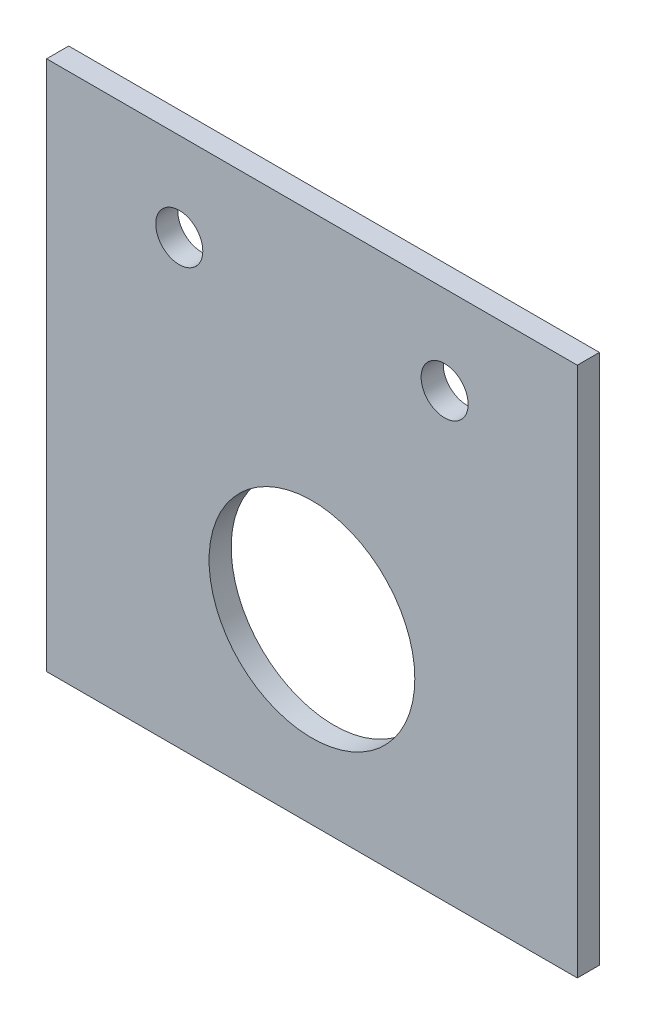
ISO-10303-21;
HEADER;
FILE_DESCRIPTION(('STEP AP214'),'2;1');
FILE_NAME('part.step','',(''),(''),'','','');
FILE_SCHEMA(('AUTOMOTIVE_DESIGN { 1 0 10303 214 1 1 1 1 }'));
ENDSEC;
DATA;
#1=APPLICATION_CONTEXT('core data for automotive mechanical design processes');
#2=APPLICATION_PROTOCOL_DEFINITION('international standard','automotive_design',2000,#1);
#3=PRODUCT_CONTEXT('',#1,'mechanical');
#4=PRODUCT('Part','Part','',(#3));
#5=PRODUCT_RELATED_PRODUCT_CATEGORY('part','',(#4));
#6=PRODUCT_DEFINITION_FORMATION('','',#4);
#7=PRODUCT_DEFINITION_CONTEXT('part definition',#1,'design');
#8=PRODUCT_DEFINITION('design','',#6,#7);
#9=PRODUCT_DEFINITION_SHAPE('','',#8);
#10=(LENGTH_UNIT() NAMED_UNIT(*) SI_UNIT(.MILLI.,.METRE.));
#11=(NAMED_UNIT(*) PLANE_ANGLE_UNIT() SI_UNIT($,.RADIAN.));
#12=(NAMED_UNIT(*) SI_UNIT($,.STERADIAN.) SOLID_ANGLE_UNIT());
#13=UNCERTAINTY_MEASURE_WITH_UNIT(LENGTH_MEASURE(1.E-05),#10,'distance_accuracy_value','');
#14=(GEOMETRIC_REPRESENTATION_CONTEXT(3) GLOBAL_UNCERTAINTY_ASSIGNED_CONTEXT((#13)) GLOBAL_UNIT_ASSIGNED_CONTEXT((#10,
#11,#12)) REPRESENTATION_CONTEXT('',''));
#15=CARTESIAN_POINT('',(0.,0.,0.));
#16=DIRECTION('',(0.,0.,1.));
#17=DIRECTION('',(1.,0.,0.));
#18=AXIS2_PLACEMENT_3D('',#15,#16,#17);
#19=CARTESIAN_POINT('',(-38.1,-38.1,3.175));
#20=DIRECTION('',(1.,0.,0.));
#21=DIRECTION('',(0.,0.,-1.));
#22=AXIS2_PLACEMENT_3D('',#19,#20,#21);
#23=PLANE('',#22);
#24=DIRECTION('',(0.,-1.,0.));
#25=VECTOR('',#24,1.);
#26=CARTESIAN_POINT('',(-38.1,-38.1,0.));
#27=LINE('',#26,#25);
#28=CARTESIAN_POINT('',(-38.1,38.1,0.));
#29=VERTEX_POINT('',#28);
#30=CARTESIAN_POINT('',(-38.1,-38.1,0.));
#31=VERTEX_POINT('',#30);
#32=EDGE_CURVE('E106',#29,#31,#27,.T.);
#33=ORIENTED_EDGE('',*,*,#32,.T.);
#34=DIRECTION('',(0.,0.,-1.));
#35=VECTOR('',#34,1.);
#36=CARTESIAN_POINT('',(-38.1,-38.1,3.175));
#37=LINE('',#36,#35);
#38=CARTESIAN_POINT('',(-38.1,-38.1,3.175));
#39=VERTEX_POINT('',#38);
#40=EDGE_CURVE('E11',#39,#31,#37,.T.);
#41=ORIENTED_EDGE('',*,*,#40,.F.);
#42=DIRECTION('',(0.,-1.,0.));
#43=VECTOR('',#42,1.);
#44=CARTESIAN_POINT('',(-38.1,-38.1,3.175));
#45=LINE('',#44,#43);
#46=CARTESIAN_POINT('',(-38.1,38.1,3.175));
#47=VERTEX_POINT('',#46);
#48=EDGE_CURVE('E90',#47,#39,#45,.T.);
#49=ORIENTED_EDGE('',*,*,#48,.F.);
#50=DIRECTION('',(0.,0.,-1.));
#51=VECTOR('',#50,1.);
#52=CARTESIAN_POINT('',(-38.1,38.1,3.175));
#53=LINE('',#52,#51);
#54=EDGE_CURVE('E102',#47,#29,#53,.T.);
#55=ORIENTED_EDGE('',*,*,#54,.T.);
#56=EDGE_LOOP('',(#33,#41,#49,#55));
#57=FACE_BOUND('',#56,.T.);
#58=ADVANCED_FACE('F38',(#57),#23,.F.);
#59=CARTESIAN_POINT('',(38.1,-38.1,3.175));
#60=DIRECTION('',(0.,1.,0.));
#61=DIRECTION('',(-1.,0.,0.));
#62=AXIS2_PLACEMENT_3D('',#59,#60,#61);
#63=PLANE('',#62);
#64=DIRECTION('',(1.,0.,0.));
#65=VECTOR('',#64,1.);
#66=CARTESIAN_POINT('',(38.1,-38.1,0.));
#67=LINE('',#66,#65);
#68=CARTESIAN_POINT('',(38.1,-38.1,0.));
#69=VERTEX_POINT('',#68);
#70=EDGE_CURVE('E95',#31,#69,#67,.T.);
#71=ORIENTED_EDGE('',*,*,#70,.T.);
#72=DIRECTION('',(0.,0.,-1.));
#73=VECTOR('',#72,1.);
#74=CARTESIAN_POINT('',(38.1,-38.1,3.175));
#75=LINE('',#74,#73);
#76=CARTESIAN_POINT('',(38.1,-38.1,3.175));
#77=VERTEX_POINT('',#76);
#78=EDGE_CURVE('E47',#77,#69,#75,.T.);
#79=ORIENTED_EDGE('',*,*,#78,.F.);
#80=DIRECTION('',(1.,0.,0.));
#81=VECTOR('',#80,1.);
#82=CARTESIAN_POINT('',(38.1,-38.1,3.175));
#83=LINE('',#82,#81);
#84=EDGE_CURVE('E85',#39,#77,#83,.T.);
#85=ORIENTED_EDGE('',*,*,#84,.F.);
#86=ORIENTED_EDGE('',*,*,#40,.T.);
#87=EDGE_LOOP('',(#71,#79,#85,#86));
#88=FACE_BOUND('',#87,.T.);
#89=ADVANCED_FACE('F94',(#88),#63,.F.);
#90=CARTESIAN_POINT('',(38.1,-38.1,3.175));
#91=DIRECTION('',(-1.,0.,0.));
#92=DIRECTION('',(0.,0.,1.));
#93=AXIS2_PLACEMENT_3D('',#90,#91,#92);
#94=PLANE('',#93);
#95=DIRECTION('',(0.,1.,0.));
#96=VECTOR('',#95,1.);
#97=CARTESIAN_POINT('',(38.1,-38.1,0.));
#98=LINE('',#97,#96);
#99=CARTESIAN_POINT('',(38.1,38.1,0.));
#100=VERTEX_POINT('',#99);
#101=EDGE_CURVE('E72',#69,#100,#98,.T.);
#102=ORIENTED_EDGE('',*,*,#101,.T.);
#103=DIRECTION('',(0.,0.,-1.));
#104=VECTOR('',#103,1.);
#105=CARTESIAN_POINT('',(38.1,38.1,3.175));
#106=LINE('',#105,#104);
#107=CARTESIAN_POINT('',(38.1,38.1,3.175));
#108=VERTEX_POINT('',#107);
#109=EDGE_CURVE('E97',#108,#100,#106,.T.);
#110=ORIENTED_EDGE('',*,*,#109,.F.);
#111=DIRECTION('',(0.,1.,0.));
#112=VECTOR('',#111,1.);
#113=CARTESIAN_POINT('',(38.1,-38.1,3.175));
#114=LINE('',#113,#112);
#115=EDGE_CURVE('E88',#77,#108,#114,.T.);
#116=ORIENTED_EDGE('',*,*,#115,.F.);
#117=ORIENTED_EDGE('',*,*,#78,.T.);
#118=EDGE_LOOP('',(#102,#110,#116,#117));
#119=FACE_BOUND('',#118,.T.);
#120=ADVANCED_FACE('F98',(#119),#94,.F.);
#121=CARTESIAN_POINT('',(38.1,38.1,3.175));
#122=DIRECTION('',(0.,-1.,0.));
#123=DIRECTION('',(1.,0.,0.));
#124=AXIS2_PLACEMENT_3D('',#121,#122,#123);
#125=PLANE('',#124);
#126=DIRECTION('',(-1.,0.,0.));
#127=VECTOR('',#126,1.);
#128=CARTESIAN_POINT('',(38.1,38.1,0.));
#129=LINE('',#128,#127);
#130=EDGE_CURVE('E78',#100,#29,#129,.T.);
#131=ORIENTED_EDGE('',*,*,#130,.T.);
#132=ORIENTED_EDGE('',*,*,#54,.F.);
#133=DIRECTION('',(-1.,0.,0.));
#134=VECTOR('',#133,1.);
#135=CARTESIAN_POINT('',(38.1,38.1,3.175));
#136=LINE('',#135,#134);
#137=EDGE_CURVE('E55',#108,#47,#136,.T.);
#138=ORIENTED_EDGE('',*,*,#137,.F.);
#139=ORIENTED_EDGE('',*,*,#109,.T.);
#140=EDGE_LOOP('',(#131,#132,#138,#139));
#141=FACE_BOUND('',#140,.T.);
#142=ADVANCED_FACE('F120',(#141),#125,.F.);
#143=CARTESIAN_POINT('',(0.,0.,3.175));
#144=DIRECTION('',(0.,0.,1.));
#145=DIRECTION('',(1.,0.,0.));
#146=AXIS2_PLACEMENT_3D('',#143,#144,#145);
#147=PLANE('',#146);
#148=CARTESIAN_POINT('',(0.,-12.5521964507144,3.175));
#149=DIRECTION('',(0.,0.,1.));
#150=DIRECTION('',(1.,0.,0.));
#151=AXIS2_PLACEMENT_3D('',#148,#149,#150);
#152=CIRCLE('',#151,14.77);
#153=CARTESIAN_POINT('',(14.77,-12.5521964507144,3.175));
#154=VERTEX_POINT('',#153);
#155=EDGE_CURVE('E142',#154,#154,#152,.T.);
#156=ORIENTED_EDGE('',*,*,#155,.F.);
#157=EDGE_LOOP('',(#156));
#158=FACE_BOUND('',#157,.T.);
#159=CARTESIAN_POINT('',(-19.05,25.4,3.175));
#160=DIRECTION('',(0.,0.,1.));
#161=DIRECTION('',(1.,0.,0.));
#162=AXIS2_PLACEMENT_3D('',#159,#160,#161);
#163=CIRCLE('',#162,3.37819999999999);
#164=CARTESIAN_POINT('',(-15.6718,25.4,3.175));
#165=VERTEX_POINT('',#164);
#166=EDGE_CURVE('E138',#165,#165,#163,.T.);
#167=ORIENTED_EDGE('',*,*,#166,.F.);
#168=EDGE_LOOP('',(#167));
#169=FACE_BOUND('',#168,.T.);
#170=CARTESIAN_POINT('',(19.05,25.4,3.175));
#171=DIRECTION('',(0.,0.,1.));
#172=DIRECTION('',(1.,0.,0.));
#173=AXIS2_PLACEMENT_3D('',#170,#171,#172);
#174=CIRCLE('',#173,3.37819999999999);
#175=CARTESIAN_POINT('',(22.4282,25.4,3.175));
#176=VERTEX_POINT('',#175);
#177=EDGE_CURVE('E130',#176,#176,#174,.T.);
#178=ORIENTED_EDGE('',*,*,#177,.F.);
#179=EDGE_LOOP('',(#178));
#180=FACE_BOUND('',#179,.T.);
#181=ORIENTED_EDGE('',*,*,#48,.T.);
#182=ORIENTED_EDGE('',*,*,#84,.T.);
#183=ORIENTED_EDGE('',*,*,#115,.T.);
#184=ORIENTED_EDGE('',*,*,#137,.T.);
#185=EDGE_LOOP('',(#181,#182,#183,#184));
#186=FACE_BOUND('',#185,.T.);
#187=ADVANCED_FACE('F86',(#158,#169,#180,#186),#147,.T.);
#188=CARTESIAN_POINT('',(0.,0.,0.));
#189=DIRECTION('',(0.,0.,1.));
#190=DIRECTION('',(1.,0.,0.));
#191=AXIS2_PLACEMENT_3D('',#188,#189,#190);
#192=PLANE('',#191);
#193=CARTESIAN_POINT('',(0.,-12.5521964507144,0.));
#194=DIRECTION('',(0.,0.,1.));
#195=DIRECTION('',(1.,0.,0.));
#196=AXIS2_PLACEMENT_3D('',#193,#194,#195);
#197=CIRCLE('',#196,14.77);
#198=CARTESIAN_POINT('',(14.77,-12.5521964507144,0.));
#199=VERTEX_POINT('',#198);
#200=EDGE_CURVE('E146',#199,#199,#197,.T.);
#201=ORIENTED_EDGE('',*,*,#200,.T.);
#202=EDGE_LOOP('',(#201));
#203=FACE_BOUND('',#202,.T.);
#204=CARTESIAN_POINT('',(-19.05,25.4,0.));
#205=DIRECTION('',(0.,0.,1.));
#206=DIRECTION('',(1.,0.,0.));
#207=AXIS2_PLACEMENT_3D('',#204,#205,#206);
#208=CIRCLE('',#207,3.3782);
#209=CARTESIAN_POINT('',(-15.6718,25.4,0.));
#210=VERTEX_POINT('',#209);
#211=EDGE_CURVE('E134',#210,#210,#208,.T.);
#212=ORIENTED_EDGE('',*,*,#211,.T.);
#213=EDGE_LOOP('',(#212));
#214=FACE_BOUND('',#213,.T.);
#215=CARTESIAN_POINT('',(19.05,25.4,0.));
#216=DIRECTION('',(0.,0.,1.));
#217=DIRECTION('',(1.,0.,0.));
#218=AXIS2_PLACEMENT_3D('',#215,#216,#217);
#219=CIRCLE('',#218,3.3782);
#220=CARTESIAN_POINT('',(22.4282,25.4,0.));
#221=VERTEX_POINT('',#220);
#222=EDGE_CURVE('E110',#221,#221,#219,.T.);
#223=ORIENTED_EDGE('',*,*,#222,.T.);
#224=EDGE_LOOP('',(#223));
#225=FACE_BOUND('',#224,.T.);
#226=ORIENTED_EDGE('',*,*,#32,.F.);
#227=ORIENTED_EDGE('',*,*,#130,.F.);
#228=ORIENTED_EDGE('',*,*,#101,.F.);
#229=ORIENTED_EDGE('',*,*,#70,.F.);
#230=EDGE_LOOP('',(#226,#227,#228,#229));
#231=FACE_BOUND('',#230,.T.);
#232=ADVANCED_FACE('F123',(#203,#214,#225,#231),#192,.F.);
#233=CARTESIAN_POINT('',(19.05,25.4,3.175));
#234=DIRECTION('',(0.,0.,1.));
#235=DIRECTION('',(1.,0.,0.));
#236=AXIS2_PLACEMENT_3D('',#233,#234,#235);
#237=CYLINDRICAL_SURFACE('',#236,3.37819999999999);
#238=ORIENTED_EDGE('',*,*,#222,.F.);
#239=EDGE_LOOP('',(#238));
#240=FACE_BOUND('',#239,.T.);
#241=ORIENTED_EDGE('',*,*,#177,.T.);
#242=EDGE_LOOP('',(#241));
#243=FACE_BOUND('',#242,.T.);
#244=ADVANCED_FACE('F161',(#240,#243),#237,.F.);
#245=CARTESIAN_POINT('',(-19.05,25.4,3.175));
#246=DIRECTION('',(0.,0.,1.));
#247=DIRECTION('',(1.,0.,0.));
#248=AXIS2_PLACEMENT_3D('',#245,#246,#247);
#249=CYLINDRICAL_SURFACE('',#248,3.37819999999999);
#250=ORIENTED_EDGE('',*,*,#211,.F.);
#251=EDGE_LOOP('',(#250));
#252=FACE_BOUND('',#251,.T.);
#253=ORIENTED_EDGE('',*,*,#166,.T.);
#254=EDGE_LOOP('',(#253));
#255=FACE_BOUND('',#254,.T.);
#256=ADVANCED_FACE('F155',(#252,#255),#249,.F.);
#257=CARTESIAN_POINT('',(0.,-12.5521964507144,0.));
#258=DIRECTION('',(0.,0.,1.));
#259=DIRECTION('',(1.,0.,0.));
#260=AXIS2_PLACEMENT_3D('',#257,#258,#259);
#261=CYLINDRICAL_SURFACE('',#260,14.77);
#262=ORIENTED_EDGE('',*,*,#155,.T.);
#263=EDGE_LOOP('',(#262));
#264=FACE_BOUND('',#263,.T.);
#265=ORIENTED_EDGE('',*,*,#200,.F.);
#266=EDGE_LOOP('',(#265));
#267=FACE_BOUND('',#266,.T.);
#268=ADVANCED_FACE('F153',(#264,#267),#261,.F.);
#269=CLOSED_SHELL('',(#58,#89,#120,#142,#187,#232,#244,#256,#268));
#270=MANIFOLD_SOLID_BREP('B2',#269);
#271=ADVANCED_BREP_SHAPE_REPRESENTATION('',(#18,#270),#14);
#272=SHAPE_DEFINITION_REPRESENTATION(#9,#271);
ENDSEC;
END-ISO-10303-21;
